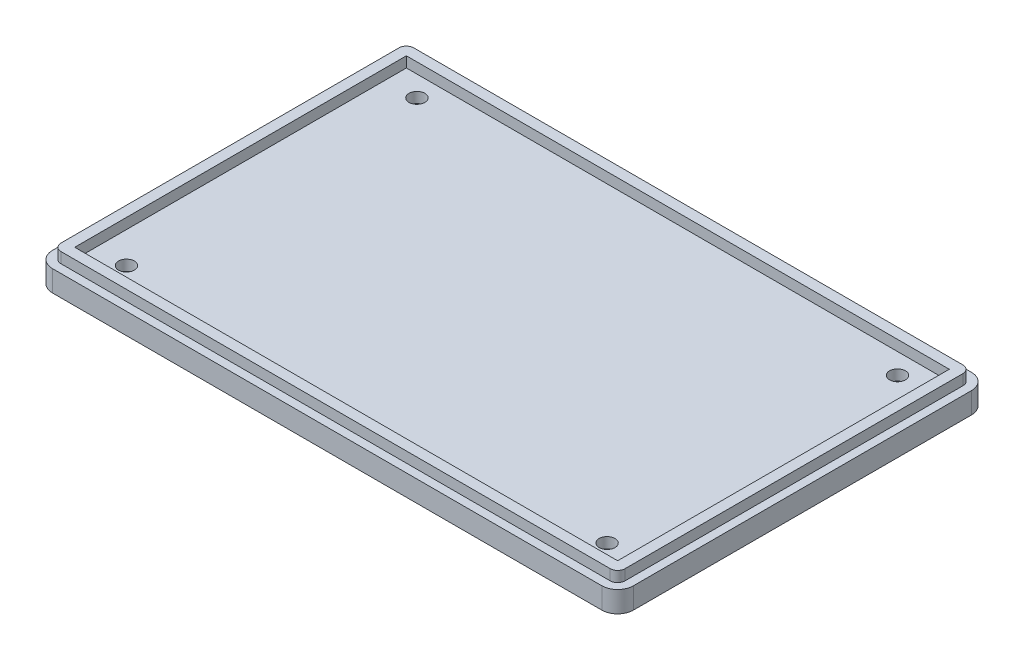
ISO-10303-21;
HEADER;
FILE_DESCRIPTION(('STEP AP214'),'2;1');
FILE_NAME('part.step','',(''),(''),'','','');
FILE_SCHEMA(('AUTOMOTIVE_DESIGN { 1 0 10303 214 1 1 1 1 }'));
ENDSEC;
DATA;
#1=APPLICATION_CONTEXT('core data for automotive mechanical design processes');
#2=APPLICATION_PROTOCOL_DEFINITION('international standard','automotive_design',2000,#1);
#3=PRODUCT_CONTEXT('',#1,'mechanical');
#4=PRODUCT('Part','Part','',(#3));
#5=PRODUCT_RELATED_PRODUCT_CATEGORY('part','',(#4));
#6=PRODUCT_DEFINITION_FORMATION('','',#4);
#7=PRODUCT_DEFINITION_CONTEXT('part definition',#1,'design');
#8=PRODUCT_DEFINITION('design','',#6,#7);
#9=PRODUCT_DEFINITION_SHAPE('','',#8);
#10=(LENGTH_UNIT() NAMED_UNIT(*) SI_UNIT(.MILLI.,.METRE.));
#11=(NAMED_UNIT(*) PLANE_ANGLE_UNIT() SI_UNIT($,.RADIAN.));
#12=(NAMED_UNIT(*) SI_UNIT($,.STERADIAN.) SOLID_ANGLE_UNIT());
#13=UNCERTAINTY_MEASURE_WITH_UNIT(LENGTH_MEASURE(1.E-05),#10,'distance_accuracy_value','');
#14=(GEOMETRIC_REPRESENTATION_CONTEXT(3) GLOBAL_UNCERTAINTY_ASSIGNED_CONTEXT((#13)) GLOBAL_UNIT_ASSIGNED_CONTEXT((#10,
#11,#12)) REPRESENTATION_CONTEXT('',''));
#15=CARTESIAN_POINT('',(0.,0.,0.));
#16=DIRECTION('',(0.,0.,1.));
#17=DIRECTION('',(1.,0.,0.));
#18=AXIS2_PLACEMENT_3D('',#15,#16,#17);
#19=CARTESIAN_POINT('',(-45.5,6.,27.5));
#20=DIRECTION('',(0.,-1.,0.));
#21=DIRECTION('',(0.,0.,-1.));
#22=AXIS2_PLACEMENT_3D('',#19,#20,#21);
#23=CYLINDRICAL_SURFACE('',#22,1.5);
#24=CARTESIAN_POINT('',(-45.5,4.,27.5));
#25=DIRECTION('',(0.,-1.,0.));
#26=DIRECTION('',(0.,0.,-1.));
#27=AXIS2_PLACEMENT_3D('',#24,#25,#26);
#28=CIRCLE('',#27,1.5);
#29=CARTESIAN_POINT('',(-45.5,4.,26.));
#30=VERTEX_POINT('',#29);
#31=EDGE_CURVE('E369',#30,#30,#28,.T.);
#32=ORIENTED_EDGE('',*,*,#31,.F.);
#33=EDGE_LOOP('',(#32));
#34=FACE_BOUND('',#33,.T.);
#35=CARTESIAN_POINT('',(-45.5,2.,27.5));
#36=DIRECTION('',(0.,-1.,0.));
#37=DIRECTION('',(0.,0.,-1.));
#38=AXIS2_PLACEMENT_3D('',#35,#36,#37);
#39=CIRCLE('',#38,1.5);
#40=CARTESIAN_POINT('',(-45.5,2.,26.));
#41=VERTEX_POINT('',#40);
#42=EDGE_CURVE('E74',#41,#41,#39,.F.);
#43=ORIENTED_EDGE('',*,*,#42,.F.);
#44=EDGE_LOOP('',(#43));
#45=FACE_BOUND('',#44,.T.);
#46=ADVANCED_FACE('F70',(#34,#45),#23,.F.);
#47=CARTESIAN_POINT('',(45.5,6.,27.5));
#48=DIRECTION('',(0.,-1.,0.));
#49=DIRECTION('',(0.,0.,-1.));
#50=AXIS2_PLACEMENT_3D('',#47,#48,#49);
#51=CYLINDRICAL_SURFACE('',#50,1.5);
#52=CARTESIAN_POINT('',(45.5,4.,27.5));
#53=DIRECTION('',(0.,-1.,0.));
#54=DIRECTION('',(0.,0.,-1.));
#55=AXIS2_PLACEMENT_3D('',#52,#53,#54);
#56=CIRCLE('',#55,1.5);
#57=CARTESIAN_POINT('',(45.5,4.,26.));
#58=VERTEX_POINT('',#57);
#59=EDGE_CURVE('E372',#58,#58,#56,.T.);
#60=ORIENTED_EDGE('',*,*,#59,.F.);
#61=EDGE_LOOP('',(#60));
#62=FACE_BOUND('',#61,.T.);
#63=CARTESIAN_POINT('',(45.5,2.,27.5));
#64=DIRECTION('',(0.,-1.,0.));
#65=DIRECTION('',(0.,0.,-1.));
#66=AXIS2_PLACEMENT_3D('',#63,#64,#65);
#67=CIRCLE('',#66,1.5);
#68=CARTESIAN_POINT('',(45.5,2.,26.));
#69=VERTEX_POINT('',#68);
#70=EDGE_CURVE('E386',#69,#69,#67,.F.);
#71=ORIENTED_EDGE('',*,*,#70,.F.);
#72=EDGE_LOOP('',(#71));
#73=FACE_BOUND('',#72,.T.);
#74=ADVANCED_FACE('F396',(#62,#73),#51,.F.);
#75=CARTESIAN_POINT('',(45.5,6.,-27.5));
#76=DIRECTION('',(0.,-1.,0.));
#77=DIRECTION('',(0.,0.,-1.));
#78=AXIS2_PLACEMENT_3D('',#75,#76,#77);
#79=CYLINDRICAL_SURFACE('',#78,1.5);
#80=CARTESIAN_POINT('',(45.5,4.,-27.5));
#81=DIRECTION('',(0.,-1.,0.));
#82=DIRECTION('',(0.,0.,-1.));
#83=AXIS2_PLACEMENT_3D('',#80,#81,#82);
#84=CIRCLE('',#83,1.5);
#85=CARTESIAN_POINT('',(45.5,4.,-29.));
#86=VERTEX_POINT('',#85);
#87=EDGE_CURVE('E375',#86,#86,#84,.T.);
#88=ORIENTED_EDGE('',*,*,#87,.F.);
#89=EDGE_LOOP('',(#88));
#90=FACE_BOUND('',#89,.T.);
#91=CARTESIAN_POINT('',(45.5,2.,-27.5));
#92=DIRECTION('',(0.,-1.,0.));
#93=DIRECTION('',(0.,0.,-1.));
#94=AXIS2_PLACEMENT_3D('',#91,#92,#93);
#95=CIRCLE('',#94,1.5);
#96=CARTESIAN_POINT('',(45.5,2.,-29.));
#97=VERTEX_POINT('',#96);
#98=EDGE_CURVE('E383',#97,#97,#95,.F.);
#99=ORIENTED_EDGE('',*,*,#98,.F.);
#100=EDGE_LOOP('',(#99));
#101=FACE_BOUND('',#100,.T.);
#102=ADVANCED_FACE('F402',(#90,#101),#79,.F.);
#103=CARTESIAN_POINT('',(-45.5,6.,-27.5));
#104=DIRECTION('',(0.,-1.,0.));
#105=DIRECTION('',(0.,0.,-1.));
#106=AXIS2_PLACEMENT_3D('',#103,#104,#105);
#107=CYLINDRICAL_SURFACE('',#106,1.5);
#108=CARTESIAN_POINT('',(-45.5,4.,-27.5));
#109=DIRECTION('',(0.,-1.,0.));
#110=DIRECTION('',(0.,0.,-1.));
#111=AXIS2_PLACEMENT_3D('',#108,#109,#110);
#112=CIRCLE('',#111,1.5);
#113=CARTESIAN_POINT('',(-45.5,4.,-29.));
#114=VERTEX_POINT('',#113);
#115=EDGE_CURVE('E242',#114,#114,#112,.T.);
#116=ORIENTED_EDGE('',*,*,#115,.F.);
#117=EDGE_LOOP('',(#116));
#118=FACE_BOUND('',#117,.T.);
#119=CARTESIAN_POINT('',(-45.5,2.,-27.5));
#120=DIRECTION('',(0.,-1.,0.));
#121=DIRECTION('',(0.,0.,-1.));
#122=AXIS2_PLACEMENT_3D('',#119,#120,#121);
#123=CIRCLE('',#122,1.5);
#124=CARTESIAN_POINT('',(-45.5,2.,-29.));
#125=VERTEX_POINT('',#124);
#126=EDGE_CURVE('E380',#125,#125,#123,.F.);
#127=ORIENTED_EDGE('',*,*,#126,.F.);
#128=EDGE_LOOP('',(#127));
#129=FACE_BOUND('',#128,.T.);
#130=ADVANCED_FACE('F408',(#118,#129),#107,.F.);
#131=CARTESIAN_POINT('',(-52.,4.,32.));
#132=DIRECTION('',(0.,-1.,0.));
#133=DIRECTION('',(0.,0.,-1.));
#134=AXIS2_PLACEMENT_3D('',#131,#132,#133);
#135=CYLINDRICAL_SURFACE('',#134,3.);
#136=CARTESIAN_POINT('',(-52.,0.,32.));
#137=DIRECTION('',(0.,-1.,0.));
#138=DIRECTION('',(0.,0.,-1.));
#139=AXIS2_PLACEMENT_3D('',#136,#137,#138);
#140=CIRCLE('',#139,3.);
#141=CARTESIAN_POINT('',(-52.,0.,35.));
#142=VERTEX_POINT('',#141);
#143=CARTESIAN_POINT('',(-55.,0.,32.));
#144=VERTEX_POINT('',#143);
#145=EDGE_CURVE('E298',#142,#144,#140,.T.);
#146=ORIENTED_EDGE('',*,*,#145,.F.);
#147=DIRECTION('',(0.,-1.,0.));
#148=VECTOR('',#147,1.);
#149=CARTESIAN_POINT('',(-52.,4.,35.));
#150=LINE('',#149,#148);
#151=CARTESIAN_POINT('',(-52.,4.,35.));
#152=VERTEX_POINT('',#151);
#153=EDGE_CURVE('E12',#152,#142,#150,.T.);
#154=ORIENTED_EDGE('',*,*,#153,.F.);
#155=CARTESIAN_POINT('',(-52.,4.,32.));
#156=DIRECTION('',(0.,-1.,0.));
#157=DIRECTION('',(0.,0.,-1.));
#158=AXIS2_PLACEMENT_3D('',#155,#156,#157);
#159=CIRCLE('',#158,3.);
#160=CARTESIAN_POINT('',(-55.,4.,32.));
#161=VERTEX_POINT('',#160);
#162=EDGE_CURVE('E312',#152,#161,#159,.T.);
#163=ORIENTED_EDGE('',*,*,#162,.T.);
#164=DIRECTION('',(0.,-1.,0.));
#165=VECTOR('',#164,1.);
#166=CARTESIAN_POINT('',(-55.,4.,32.));
#167=LINE('',#166,#165);
#168=EDGE_CURVE('E334',#161,#144,#167,.T.);
#169=ORIENTED_EDGE('',*,*,#168,.T.);
#170=EDGE_LOOP('',(#146,#154,#163,#169));
#171=FACE_BOUND('',#170,.T.);
#172=ADVANCED_FACE('F72',(#171),#135,.T.);
#173=CARTESIAN_POINT('',(-52.,4.,35.));
#174=DIRECTION('',(0.,0.,-1.));
#175=DIRECTION('',(-1.,0.,0.));
#176=AXIS2_PLACEMENT_3D('',#173,#174,#175);
#177=PLANE('',#176);
#178=DIRECTION('',(1.,0.,0.));
#179=VECTOR('',#178,1.);
#180=CARTESIAN_POINT('',(-52.,0.,35.));
#181=LINE('',#180,#179);
#182=CARTESIAN_POINT('',(52.,0.,35.));
#183=VERTEX_POINT('',#182);
#184=EDGE_CURVE('E316',#142,#183,#181,.T.);
#185=ORIENTED_EDGE('',*,*,#184,.T.);
#186=DIRECTION('',(0.,-1.,0.));
#187=VECTOR('',#186,1.);
#188=CARTESIAN_POINT('',(52.,4.,35.));
#189=LINE('',#188,#187);
#190=CARTESIAN_POINT('',(52.,4.,35.));
#191=VERTEX_POINT('',#190);
#192=EDGE_CURVE('E79',#191,#183,#189,.T.);
#193=ORIENTED_EDGE('',*,*,#192,.F.);
#194=DIRECTION('',(1.,0.,0.));
#195=VECTOR('',#194,1.);
#196=CARTESIAN_POINT('',(-52.,4.,35.));
#197=LINE('',#196,#195);
#198=EDGE_CURVE('E332',#152,#191,#197,.T.);
#199=ORIENTED_EDGE('',*,*,#198,.F.);
#200=ORIENTED_EDGE('',*,*,#153,.T.);
#201=EDGE_LOOP('',(#185,#193,#199,#200));
#202=FACE_BOUND('',#201,.T.);
#203=ADVANCED_FACE('F465',(#202),#177,.F.);
#204=CARTESIAN_POINT('',(52.,4.,32.));
#205=DIRECTION('',(0.,-1.,0.));
#206=DIRECTION('',(0.,0.,-1.));
#207=AXIS2_PLACEMENT_3D('',#204,#205,#206);
#208=CYLINDRICAL_SURFACE('',#207,3.);
#209=CARTESIAN_POINT('',(52.,0.,32.));
#210=DIRECTION('',(0.,1.,0.));
#211=DIRECTION('',(0.,0.,1.));
#212=AXIS2_PLACEMENT_3D('',#209,#210,#211);
#213=CIRCLE('',#212,3.);
#214=CARTESIAN_POINT('',(55.,0.,32.));
#215=VERTEX_POINT('',#214);
#216=EDGE_CURVE('E352',#183,#215,#213,.T.);
#217=ORIENTED_EDGE('',*,*,#216,.T.);
#218=DIRECTION('',(0.,-1.,0.));
#219=VECTOR('',#218,1.);
#220=CARTESIAN_POINT('',(55.,4.,32.));
#221=LINE('',#220,#219);
#222=CARTESIAN_POINT('',(55.,4.,32.));
#223=VERTEX_POINT('',#222);
#224=EDGE_CURVE('E357',#223,#215,#221,.T.);
#225=ORIENTED_EDGE('',*,*,#224,.F.);
#226=CARTESIAN_POINT('',(52.,4.,32.));
#227=DIRECTION('',(0.,1.,0.));
#228=DIRECTION('',(0.,0.,1.));
#229=AXIS2_PLACEMENT_3D('',#226,#227,#228);
#230=CIRCLE('',#229,3.);
#231=EDGE_CURVE('E330',#191,#223,#230,.T.);
#232=ORIENTED_EDGE('',*,*,#231,.F.);
#233=ORIENTED_EDGE('',*,*,#192,.T.);
#234=EDGE_LOOP('',(#217,#225,#232,#233));
#235=FACE_BOUND('',#234,.T.);
#236=ADVANCED_FACE('F468',(#235),#208,.T.);
#237=CARTESIAN_POINT('',(55.,4.,32.));
#238=DIRECTION('',(-1.,0.,0.));
#239=DIRECTION('',(0.,0.,1.));
#240=AXIS2_PLACEMENT_3D('',#237,#238,#239);
#241=PLANE('',#240);
#242=DIRECTION('',(0.,0.,-1.));
#243=VECTOR('',#242,1.);
#244=CARTESIAN_POINT('',(55.,0.,32.));
#245=LINE('',#244,#243);
#246=CARTESIAN_POINT('',(55.,0.,-32.));
#247=VERTEX_POINT('',#246);
#248=EDGE_CURVE('E349',#215,#247,#245,.T.);
#249=ORIENTED_EDGE('',*,*,#248,.T.);
#250=DIRECTION('',(0.,-1.,0.));
#251=VECTOR('',#250,1.);
#252=CARTESIAN_POINT('',(55.,4.,-32.));
#253=LINE('',#252,#251);
#254=CARTESIAN_POINT('',(55.,4.,-32.));
#255=VERTEX_POINT('',#254);
#256=EDGE_CURVE('E360',#255,#247,#253,.T.);
#257=ORIENTED_EDGE('',*,*,#256,.F.);
#258=DIRECTION('',(0.,0.,-1.));
#259=VECTOR('',#258,1.);
#260=CARTESIAN_POINT('',(55.,4.,32.));
#261=LINE('',#260,#259);
#262=EDGE_CURVE('E328',#223,#255,#261,.T.);
#263=ORIENTED_EDGE('',*,*,#262,.F.);
#264=ORIENTED_EDGE('',*,*,#224,.T.);
#265=EDGE_LOOP('',(#249,#257,#263,#264));
#266=FACE_BOUND('',#265,.T.);
#267=ADVANCED_FACE('F472',(#266),#241,.F.);
#268=CARTESIAN_POINT('',(52.,4.,-32.));
#269=DIRECTION('',(0.,-1.,0.));
#270=DIRECTION('',(0.,0.,-1.));
#271=AXIS2_PLACEMENT_3D('',#268,#269,#270);
#272=CYLINDRICAL_SURFACE('',#271,3.);
#273=CARTESIAN_POINT('',(52.,0.,-32.));
#274=DIRECTION('',(0.,-1.,0.));
#275=DIRECTION('',(0.,0.,-1.));
#276=AXIS2_PLACEMENT_3D('',#273,#274,#275);
#277=CIRCLE('',#276,3.);
#278=CARTESIAN_POINT('',(52.,0.,-35.));
#279=VERTEX_POINT('',#278);
#280=EDGE_CURVE('E346',#279,#247,#277,.T.);
#281=ORIENTED_EDGE('',*,*,#280,.F.);
#282=DIRECTION('',(0.,-1.,0.));
#283=VECTOR('',#282,1.);
#284=CARTESIAN_POINT('',(52.,4.,-35.));
#285=LINE('',#284,#283);
#286=CARTESIAN_POINT('',(52.,4.,-35.));
#287=VERTEX_POINT('',#286);
#288=EDGE_CURVE('E362',#287,#279,#285,.T.);
#289=ORIENTED_EDGE('',*,*,#288,.F.);
#290=CARTESIAN_POINT('',(52.,4.,-32.));
#291=DIRECTION('',(0.,-1.,0.));
#292=DIRECTION('',(0.,0.,-1.));
#293=AXIS2_PLACEMENT_3D('',#290,#291,#292);
#294=CIRCLE('',#293,3.);
#295=EDGE_CURVE('E325',#287,#255,#294,.T.);
#296=ORIENTED_EDGE('',*,*,#295,.T.);
#297=ORIENTED_EDGE('',*,*,#256,.T.);
#298=EDGE_LOOP('',(#281,#289,#296,#297));
#299=FACE_BOUND('',#298,.T.);
#300=ADVANCED_FACE('F476',(#299),#272,.T.);
#301=CARTESIAN_POINT('',(-52.,4.,-35.));
#302=DIRECTION('',(0.,0.,-1.));
#303=DIRECTION('',(-1.,0.,0.));
#304=AXIS2_PLACEMENT_3D('',#301,#302,#303);
#305=PLANE('',#304);
#306=DIRECTION('',(1.,0.,0.));
#307=VECTOR('',#306,1.);
#308=CARTESIAN_POINT('',(-52.,0.,-35.));
#309=LINE('',#308,#307);
#310=CARTESIAN_POINT('',(-52.,0.,-35.));
#311=VERTEX_POINT('',#310);
#312=EDGE_CURVE('E343',#311,#279,#309,.T.);
#313=ORIENTED_EDGE('',*,*,#312,.F.);
#314=DIRECTION('',(0.,-1.,0.));
#315=VECTOR('',#314,1.);
#316=CARTESIAN_POINT('',(-52.,4.,-35.));
#317=LINE('',#316,#315);
#318=CARTESIAN_POINT('',(-52.,4.,-35.));
#319=VERTEX_POINT('',#318);
#320=EDGE_CURVE('E364',#319,#311,#317,.T.);
#321=ORIENTED_EDGE('',*,*,#320,.F.);
#322=DIRECTION('',(1.,0.,0.));
#323=VECTOR('',#322,1.);
#324=CARTESIAN_POINT('',(-52.,4.,-35.));
#325=LINE('',#324,#323);
#326=EDGE_CURVE('E322',#319,#287,#325,.T.);
#327=ORIENTED_EDGE('',*,*,#326,.T.);
#328=ORIENTED_EDGE('',*,*,#288,.T.);
#329=EDGE_LOOP('',(#313,#321,#327,#328));
#330=FACE_BOUND('',#329,.T.);
#331=ADVANCED_FACE('F480',(#330),#305,.T.);
#332=CARTESIAN_POINT('',(-52.,4.,-32.));
#333=DIRECTION('',(0.,-1.,0.));
#334=DIRECTION('',(0.,0.,-1.));
#335=AXIS2_PLACEMENT_3D('',#332,#333,#334);
#336=CYLINDRICAL_SURFACE('',#335,3.);
#337=CARTESIAN_POINT('',(-52.,0.,-32.));
#338=DIRECTION('',(0.,-1.,0.));
#339=DIRECTION('',(0.,0.,-1.));
#340=AXIS2_PLACEMENT_3D('',#337,#338,#339);
#341=CIRCLE('',#340,3.);
#342=CARTESIAN_POINT('',(-55.,0.,-32.));
#343=VERTEX_POINT('',#342);
#344=EDGE_CURVE('E340',#343,#311,#341,.T.);
#345=ORIENTED_EDGE('',*,*,#344,.F.);
#346=DIRECTION('',(0.,-1.,0.));
#347=VECTOR('',#346,1.);
#348=CARTESIAN_POINT('',(-55.,4.,-32.));
#349=LINE('',#348,#347);
#350=CARTESIAN_POINT('',(-55.,4.,-32.));
#351=VERTEX_POINT('',#350);
#352=EDGE_CURVE('E366',#351,#343,#349,.T.);
#353=ORIENTED_EDGE('',*,*,#352,.F.);
#354=CARTESIAN_POINT('',(-52.,4.,-32.));
#355=DIRECTION('',(0.,-1.,0.));
#356=DIRECTION('',(0.,0.,-1.));
#357=AXIS2_PLACEMENT_3D('',#354,#355,#356);
#358=CIRCLE('',#357,3.);
#359=EDGE_CURVE('E319',#351,#319,#358,.T.);
#360=ORIENTED_EDGE('',*,*,#359,.T.);
#361=ORIENTED_EDGE('',*,*,#320,.T.);
#362=EDGE_LOOP('',(#345,#353,#360,#361));
#363=FACE_BOUND('',#362,.T.);
#364=ADVANCED_FACE('F484',(#363),#336,.T.);
#365=CARTESIAN_POINT('',(-55.,4.,32.));
#366=DIRECTION('',(-1.,0.,0.));
#367=DIRECTION('',(0.,0.,1.));
#368=AXIS2_PLACEMENT_3D('',#365,#366,#367);
#369=PLANE('',#368);
#370=DIRECTION('',(0.,0.,-1.));
#371=VECTOR('',#370,1.);
#372=CARTESIAN_POINT('',(-55.,0.,32.));
#373=LINE('',#372,#371);
#374=EDGE_CURVE('E337',#144,#343,#373,.T.);
#375=ORIENTED_EDGE('',*,*,#374,.F.);
#376=ORIENTED_EDGE('',*,*,#168,.F.);
#377=DIRECTION('',(0.,0.,-1.));
#378=VECTOR('',#377,1.);
#379=CARTESIAN_POINT('',(-55.,4.,32.));
#380=LINE('',#379,#378);
#381=EDGE_CURVE('E315',#161,#351,#380,.T.);
#382=ORIENTED_EDGE('',*,*,#381,.T.);
#383=ORIENTED_EDGE('',*,*,#352,.T.);
#384=EDGE_LOOP('',(#375,#376,#382,#383));
#385=FACE_BOUND('',#384,.T.);
#386=ADVANCED_FACE('F460',(#385),#369,.T.);
#387=CARTESIAN_POINT('',(-52.,4.,32.));
#388=DIRECTION('',(0.,-1.,0.));
#389=DIRECTION('',(0.,0.,-1.));
#390=AXIS2_PLACEMENT_3D('',#387,#388,#389);
#391=PLANE('',#390);
#392=DIRECTION('',(0.,0.,-1.));
#393=VECTOR('',#392,1.);
#394=CARTESIAN_POINT('',(-53.4,4.,32.));
#395=LINE('',#394,#393);
#396=CARTESIAN_POINT('',(-53.4,4.,32.));
#397=VERTEX_POINT('',#396);
#398=CARTESIAN_POINT('',(-53.4,4.,-32.));
#399=VERTEX_POINT('',#398);
#400=EDGE_CURVE('E256',#397,#399,#395,.T.);
#401=ORIENTED_EDGE('',*,*,#400,.T.);
#402=CARTESIAN_POINT('',(-52.,4.,-32.));
#403=DIRECTION('',(0.,-1.,0.));
#404=DIRECTION('',(0.,0.,-1.));
#405=AXIS2_PLACEMENT_3D('',#402,#403,#404);
#406=CIRCLE('',#405,1.4);
#407=CARTESIAN_POINT('',(-52.,4.,-33.4));
#408=VERTEX_POINT('',#407);
#409=EDGE_CURVE('E248',#399,#408,#406,.T.);
#410=ORIENTED_EDGE('',*,*,#409,.T.);
#411=DIRECTION('',(1.,0.,0.));
#412=VECTOR('',#411,1.);
#413=CARTESIAN_POINT('',(-52.,4.,-33.4));
#414=LINE('',#413,#412);
#415=CARTESIAN_POINT('',(52.,4.,-33.4));
#416=VERTEX_POINT('',#415);
#417=EDGE_CURVE('E278',#408,#416,#414,.T.);
#418=ORIENTED_EDGE('',*,*,#417,.T.);
#419=CARTESIAN_POINT('',(52.,4.,-32.));
#420=DIRECTION('',(0.,-1.,0.));
#421=DIRECTION('',(0.,0.,-1.));
#422=AXIS2_PLACEMENT_3D('',#419,#420,#421);
#423=CIRCLE('',#422,1.4);
#424=CARTESIAN_POINT('',(53.4,4.,-32.));
#425=VERTEX_POINT('',#424);
#426=EDGE_CURVE('E87',#416,#425,#423,.T.);
#427=ORIENTED_EDGE('',*,*,#426,.T.);
#428=DIRECTION('',(0.,0.,-1.));
#429=VECTOR('',#428,1.);
#430=CARTESIAN_POINT('',(53.4,4.,32.));
#431=LINE('',#430,#429);
#432=CARTESIAN_POINT('',(53.4,4.,32.));
#433=VERTEX_POINT('',#432);
#434=EDGE_CURVE('E282',#433,#425,#431,.T.);
#435=ORIENTED_EDGE('',*,*,#434,.F.);
#436=CARTESIAN_POINT('',(52.,4.,32.));
#437=DIRECTION('',(0.,-1.,0.));
#438=DIRECTION('',(0.,0.,-1.));
#439=AXIS2_PLACEMENT_3D('',#436,#437,#438);
#440=CIRCLE('',#439,1.4);
#441=CARTESIAN_POINT('',(52.,4.,33.4));
#442=VERTEX_POINT('',#441);
#443=EDGE_CURVE('E285',#433,#442,#440,.T.);
#444=ORIENTED_EDGE('',*,*,#443,.T.);
#445=DIRECTION('',(1.,0.,0.));
#446=VECTOR('',#445,1.);
#447=CARTESIAN_POINT('',(-52.,4.,33.4));
#448=LINE('',#447,#446);
#449=CARTESIAN_POINT('',(-52.,4.,33.4));
#450=VERTEX_POINT('',#449);
#451=EDGE_CURVE('E288',#450,#442,#448,.T.);
#452=ORIENTED_EDGE('',*,*,#451,.F.);
#453=CARTESIAN_POINT('',(-52.,4.,32.));
#454=DIRECTION('',(0.,-1.,0.));
#455=DIRECTION('',(0.,0.,-1.));
#456=AXIS2_PLACEMENT_3D('',#453,#454,#455);
#457=CIRCLE('',#456,1.40000000000001);
#458=EDGE_CURVE('E291',#450,#397,#457,.T.);
#459=ORIENTED_EDGE('',*,*,#458,.T.);
#460=EDGE_LOOP('',(#401,#410,#418,#427,#435,#444,#452,#459));
#461=FACE_BOUND('',#460,.T.);
#462=ORIENTED_EDGE('',*,*,#162,.F.);
#463=ORIENTED_EDGE('',*,*,#198,.T.);
#464=ORIENTED_EDGE('',*,*,#231,.T.);
#465=ORIENTED_EDGE('',*,*,#262,.T.);
#466=ORIENTED_EDGE('',*,*,#295,.F.);
#467=ORIENTED_EDGE('',*,*,#326,.F.);
#468=ORIENTED_EDGE('',*,*,#359,.F.);
#469=ORIENTED_EDGE('',*,*,#381,.F.);
#470=EDGE_LOOP('',(#462,#463,#464,#465,#466,#467,#468,#469));
#471=FACE_BOUND('',#470,.T.);
#472=ADVANCED_FACE('F457',(#461,#471),#391,.F.);
#473=CARTESIAN_POINT('',(-52.,0.,32.));
#474=DIRECTION('',(0.,-1.,0.));
#475=DIRECTION('',(0.,0.,-1.));
#476=AXIS2_PLACEMENT_3D('',#473,#474,#475);
#477=PLANE('',#476);
#478=CARTESIAN_POINT('',(45.5,0.,27.5));
#479=DIRECTION('',(0.,-1.,0.));
#480=DIRECTION('',(0.,0.,-1.));
#481=AXIS2_PLACEMENT_3D('',#478,#479,#480);
#482=CIRCLE('',#481,3.);
#483=CARTESIAN_POINT('',(45.5,0.,24.5));
#484=VERTEX_POINT('',#483);
#485=EDGE_CURVE('E585',#484,#484,#482,.T.);
#486=ORIENTED_EDGE('',*,*,#485,.F.);
#487=EDGE_LOOP('',(#486));
#488=FACE_BOUND('',#487,.T.);
#489=CARTESIAN_POINT('',(45.5,0.,-27.5));
#490=DIRECTION('',(0.,-1.,0.));
#491=DIRECTION('',(0.,0.,-1.));
#492=AXIS2_PLACEMENT_3D('',#489,#490,#491);
#493=CIRCLE('',#492,3.);
#494=CARTESIAN_POINT('',(45.5,0.,-30.5));
#495=VERTEX_POINT('',#494);
#496=EDGE_CURVE('E577',#495,#495,#493,.T.);
#497=ORIENTED_EDGE('',*,*,#496,.F.);
#498=EDGE_LOOP('',(#497));
#499=FACE_BOUND('',#498,.T.);
#500=CARTESIAN_POINT('',(-45.5,0.,-27.5));
#501=DIRECTION('',(0.,-1.,0.));
#502=DIRECTION('',(0.,0.,-1.));
#503=AXIS2_PLACEMENT_3D('',#500,#501,#502);
#504=CIRCLE('',#503,3.);
#505=CARTESIAN_POINT('',(-45.5,0.,-30.5));
#506=VERTEX_POINT('',#505);
#507=EDGE_CURVE('E571',#506,#506,#504,.T.);
#508=ORIENTED_EDGE('',*,*,#507,.F.);
#509=EDGE_LOOP('',(#508));
#510=FACE_BOUND('',#509,.T.);
#511=CARTESIAN_POINT('',(-45.5,0.,27.5));
#512=DIRECTION('',(0.,-1.,0.));
#513=DIRECTION('',(0.,0.,-1.));
#514=AXIS2_PLACEMENT_3D('',#511,#512,#513);
#515=CIRCLE('',#514,3.);
#516=CARTESIAN_POINT('',(-45.5,0.,24.5));
#517=VERTEX_POINT('',#516);
#518=EDGE_CURVE('E235',#517,#517,#515,.T.);
#519=ORIENTED_EDGE('',*,*,#518,.F.);
#520=EDGE_LOOP('',(#519));
#521=FACE_BOUND('',#520,.T.);
#522=ORIENTED_EDGE('',*,*,#145,.T.);
#523=ORIENTED_EDGE('',*,*,#374,.T.);
#524=ORIENTED_EDGE('',*,*,#344,.T.);
#525=ORIENTED_EDGE('',*,*,#312,.T.);
#526=ORIENTED_EDGE('',*,*,#280,.T.);
#527=ORIENTED_EDGE('',*,*,#248,.F.);
#528=ORIENTED_EDGE('',*,*,#216,.F.);
#529=ORIENTED_EDGE('',*,*,#184,.F.);
#530=EDGE_LOOP('',(#522,#523,#524,#525,#526,#527,#528,#529));
#531=FACE_BOUND('',#530,.T.);
#532=ADVANCED_FACE('F455',(#488,#499,#510,#521,#531),#477,.T.);
#533=CARTESIAN_POINT('',(-52.,6.,-32.));
#534=DIRECTION('',(0.,-1.,0.));
#535=DIRECTION('',(0.,0.,-1.));
#536=AXIS2_PLACEMENT_3D('',#533,#534,#535);
#537=CYLINDRICAL_SURFACE('',#536,1.4);
#538=ORIENTED_EDGE('',*,*,#409,.F.);
#539=DIRECTION('',(0.,-1.,0.));
#540=VECTOR('',#539,1.);
#541=CARTESIAN_POINT('',(-53.4,6.,-32.));
#542=LINE('',#541,#540);
#543=CARTESIAN_POINT('',(-53.4,6.,-32.));
#544=VERTEX_POINT('',#543);
#545=EDGE_CURVE('E296',#544,#399,#542,.T.);
#546=ORIENTED_EDGE('',*,*,#545,.F.);
#547=CARTESIAN_POINT('',(-52.,6.,-32.));
#548=DIRECTION('',(0.,-1.,0.));
#549=DIRECTION('',(0.,0.,-1.));
#550=AXIS2_PLACEMENT_3D('',#547,#548,#549);
#551=CIRCLE('',#550,1.4);
#552=CARTESIAN_POINT('',(-52.,6.,-33.4));
#553=VERTEX_POINT('',#552);
#554=EDGE_CURVE('E252',#544,#553,#551,.T.);
#555=ORIENTED_EDGE('',*,*,#554,.T.);
#556=DIRECTION('',(0.,-1.,0.));
#557=VECTOR('',#556,1.);
#558=CARTESIAN_POINT('',(-52.,6.,-33.4));
#559=LINE('',#558,#557);
#560=EDGE_CURVE('E275',#553,#408,#559,.T.);
#561=ORIENTED_EDGE('',*,*,#560,.T.);
#562=EDGE_LOOP('',(#538,#546,#555,#561));
#563=FACE_BOUND('',#562,.T.);
#564=ADVANCED_FACE('F430',(#563),#537,.T.);
#565=CARTESIAN_POINT('',(-53.4,6.,32.));
#566=DIRECTION('',(-1.,0.,0.));
#567=DIRECTION('',(0.,0.,1.));
#568=AXIS2_PLACEMENT_3D('',#565,#566,#567);
#569=PLANE('',#568);
#570=ORIENTED_EDGE('',*,*,#400,.F.);
#571=DIRECTION('',(0.,-1.,0.));
#572=VECTOR('',#571,1.);
#573=CARTESIAN_POINT('',(-53.4,6.,32.));
#574=LINE('',#573,#572);
#575=CARTESIAN_POINT('',(-53.4,6.,32.));
#576=VERTEX_POINT('',#575);
#577=EDGE_CURVE('E299',#576,#397,#574,.T.);
#578=ORIENTED_EDGE('',*,*,#577,.F.);
#579=DIRECTION('',(0.,0.,-1.));
#580=VECTOR('',#579,1.);
#581=CARTESIAN_POINT('',(-53.4,6.,32.));
#582=LINE('',#581,#580);
#583=EDGE_CURVE('E272',#576,#544,#582,.T.);
#584=ORIENTED_EDGE('',*,*,#583,.T.);
#585=ORIENTED_EDGE('',*,*,#545,.T.);
#586=EDGE_LOOP('',(#570,#578,#584,#585));
#587=FACE_BOUND('',#586,.T.);
#588=ADVANCED_FACE('F426',(#587),#569,.T.);
#589=CARTESIAN_POINT('',(-52.,6.,32.));
#590=DIRECTION('',(0.,-1.,0.));
#591=DIRECTION('',(0.,0.,-1.));
#592=AXIS2_PLACEMENT_3D('',#589,#590,#591);
#593=CYLINDRICAL_SURFACE('',#592,1.40000000000001);
#594=ORIENTED_EDGE('',*,*,#458,.F.);
#595=DIRECTION('',(0.,-1.,0.));
#596=VECTOR('',#595,1.);
#597=CARTESIAN_POINT('',(-52.,6.,33.4));
#598=LINE('',#597,#596);
#599=CARTESIAN_POINT('',(-52.,6.,33.4));
#600=VERTEX_POINT('',#599);
#601=EDGE_CURVE('E301',#600,#450,#598,.T.);
#602=ORIENTED_EDGE('',*,*,#601,.F.);
#603=CARTESIAN_POINT('',(-52.,6.,32.));
#604=DIRECTION('',(0.,-1.,0.));
#605=DIRECTION('',(0.,0.,-1.));
#606=AXIS2_PLACEMENT_3D('',#603,#604,#605);
#607=CIRCLE('',#606,1.40000000000001);
#608=EDGE_CURVE('E269',#600,#576,#607,.T.);
#609=ORIENTED_EDGE('',*,*,#608,.T.);
#610=ORIENTED_EDGE('',*,*,#577,.T.);
#611=EDGE_LOOP('',(#594,#602,#609,#610));
#612=FACE_BOUND('',#611,.T.);
#613=ADVANCED_FACE('F429',(#612),#593,.T.);
#614=CARTESIAN_POINT('',(-52.,6.,33.4));
#615=DIRECTION('',(0.,0.,-1.));
#616=DIRECTION('',(-1.,0.,0.));
#617=AXIS2_PLACEMENT_3D('',#614,#615,#616);
#618=PLANE('',#617);
#619=ORIENTED_EDGE('',*,*,#451,.T.);
#620=DIRECTION('',(0.,-1.,0.));
#621=VECTOR('',#620,1.);
#622=CARTESIAN_POINT('',(52.,6.,33.4));
#623=LINE('',#622,#621);
#624=CARTESIAN_POINT('',(52.,6.,33.4));
#625=VERTEX_POINT('',#624);
#626=EDGE_CURVE('E303',#625,#442,#623,.T.);
#627=ORIENTED_EDGE('',*,*,#626,.F.);
#628=DIRECTION('',(1.,0.,0.));
#629=VECTOR('',#628,1.);
#630=CARTESIAN_POINT('',(-52.,6.,33.4));
#631=LINE('',#630,#629);
#632=EDGE_CURVE('E267',#600,#625,#631,.T.);
#633=ORIENTED_EDGE('',*,*,#632,.F.);
#634=ORIENTED_EDGE('',*,*,#601,.T.);
#635=EDGE_LOOP('',(#619,#627,#633,#634));
#636=FACE_BOUND('',#635,.T.);
#637=ADVANCED_FACE('F434',(#636),#618,.F.);
#638=CARTESIAN_POINT('',(52.,6.,32.));
#639=DIRECTION('',(0.,-1.,0.));
#640=DIRECTION('',(0.,0.,-1.));
#641=AXIS2_PLACEMENT_3D('',#638,#639,#640);
#642=CYLINDRICAL_SURFACE('',#641,1.4);
#643=ORIENTED_EDGE('',*,*,#443,.F.);
#644=DIRECTION('',(0.,-1.,0.));
#645=VECTOR('',#644,1.);
#646=CARTESIAN_POINT('',(53.4,6.,32.));
#647=LINE('',#646,#645);
#648=CARTESIAN_POINT('',(53.4,6.,32.));
#649=VERTEX_POINT('',#648);
#650=EDGE_CURVE('E305',#649,#433,#647,.T.);
#651=ORIENTED_EDGE('',*,*,#650,.F.);
#652=CARTESIAN_POINT('',(52.,6.,32.));
#653=DIRECTION('',(0.,-1.,0.));
#654=DIRECTION('',(0.,0.,-1.));
#655=AXIS2_PLACEMENT_3D('',#652,#653,#654);
#656=CIRCLE('',#655,1.4);
#657=EDGE_CURVE('E264',#649,#625,#656,.T.);
#658=ORIENTED_EDGE('',*,*,#657,.T.);
#659=ORIENTED_EDGE('',*,*,#626,.T.);
#660=EDGE_LOOP('',(#643,#651,#658,#659));
#661=FACE_BOUND('',#660,.T.);
#662=ADVANCED_FACE('F438',(#661),#642,.T.);
#663=CARTESIAN_POINT('',(53.4,6.,32.));
#664=DIRECTION('',(-1.,0.,0.));
#665=DIRECTION('',(0.,0.,1.));
#666=AXIS2_PLACEMENT_3D('',#663,#664,#665);
#667=PLANE('',#666);
#668=ORIENTED_EDGE('',*,*,#434,.T.);
#669=DIRECTION('',(0.,-1.,0.));
#670=VECTOR('',#669,1.);
#671=CARTESIAN_POINT('',(53.4,6.,-32.));
#672=LINE('',#671,#670);
#673=CARTESIAN_POINT('',(53.4,6.,-32.));
#674=VERTEX_POINT('',#673);
#675=EDGE_CURVE('E307',#674,#425,#672,.T.);
#676=ORIENTED_EDGE('',*,*,#675,.F.);
#677=DIRECTION('',(0.,0.,-1.));
#678=VECTOR('',#677,1.);
#679=CARTESIAN_POINT('',(53.4,6.,32.));
#680=LINE('',#679,#678);
#681=EDGE_CURVE('E262',#649,#674,#680,.T.);
#682=ORIENTED_EDGE('',*,*,#681,.F.);
#683=ORIENTED_EDGE('',*,*,#650,.T.);
#684=EDGE_LOOP('',(#668,#676,#682,#683));
#685=FACE_BOUND('',#684,.T.);
#686=ADVANCED_FACE('F442',(#685),#667,.F.);
#687=CARTESIAN_POINT('',(52.,6.,-32.));
#688=DIRECTION('',(0.,-1.,0.));
#689=DIRECTION('',(0.,0.,-1.));
#690=AXIS2_PLACEMENT_3D('',#687,#688,#689);
#691=CYLINDRICAL_SURFACE('',#690,1.4);
#692=ORIENTED_EDGE('',*,*,#426,.F.);
#693=DIRECTION('',(0.,-1.,0.));
#694=VECTOR('',#693,1.);
#695=CARTESIAN_POINT('',(52.,6.,-33.4));
#696=LINE('',#695,#694);
#697=CARTESIAN_POINT('',(52.,6.,-33.4));
#698=VERTEX_POINT('',#697);
#699=EDGE_CURVE('E309',#698,#416,#696,.T.);
#700=ORIENTED_EDGE('',*,*,#699,.F.);
#701=CARTESIAN_POINT('',(52.,6.,-32.));
#702=DIRECTION('',(0.,-1.,0.));
#703=DIRECTION('',(0.,0.,-1.));
#704=AXIS2_PLACEMENT_3D('',#701,#702,#703);
#705=CIRCLE('',#704,1.4);
#706=EDGE_CURVE('E259',#698,#674,#705,.T.);
#707=ORIENTED_EDGE('',*,*,#706,.T.);
#708=ORIENTED_EDGE('',*,*,#675,.T.);
#709=EDGE_LOOP('',(#692,#700,#707,#708));
#710=FACE_BOUND('',#709,.T.);
#711=ADVANCED_FACE('F446',(#710),#691,.T.);
#712=CARTESIAN_POINT('',(-52.,6.,-33.4));
#713=DIRECTION('',(0.,0.,-1.));
#714=DIRECTION('',(-1.,0.,0.));
#715=AXIS2_PLACEMENT_3D('',#712,#713,#714);
#716=PLANE('',#715);
#717=ORIENTED_EDGE('',*,*,#417,.F.);
#718=ORIENTED_EDGE('',*,*,#560,.F.);
#719=DIRECTION('',(1.,0.,0.));
#720=VECTOR('',#719,1.);
#721=CARTESIAN_POINT('',(-52.,6.,-33.4));
#722=LINE('',#721,#720);
#723=EDGE_CURVE('E255',#553,#698,#722,.T.);
#724=ORIENTED_EDGE('',*,*,#723,.T.);
#725=ORIENTED_EDGE('',*,*,#699,.T.);
#726=EDGE_LOOP('',(#717,#718,#724,#725));
#727=FACE_BOUND('',#726,.T.);
#728=ADVANCED_FACE('F425',(#727),#716,.T.);
#729=CARTESIAN_POINT('',(-52.,6.,-32.));
#730=DIRECTION('',(0.,-1.,0.));
#731=DIRECTION('',(0.,0.,-1.));
#732=AXIS2_PLACEMENT_3D('',#729,#730,#731);
#733=PLANE('',#732);
#734=DIRECTION('',(0.,0.,-1.));
#735=VECTOR('',#734,1.);
#736=CARTESIAN_POINT('',(-51.4,6.,32.));
#737=LINE('',#736,#735);
#738=CARTESIAN_POINT('',(-51.4,6.,31.4));
#739=VERTEX_POINT('',#738);
#740=CARTESIAN_POINT('',(-51.4,6.,-31.4));
#741=VERTEX_POINT('',#740);
#742=EDGE_CURVE('E224',#739,#741,#737,.T.);
#743=ORIENTED_EDGE('',*,*,#742,.T.);
#744=DIRECTION('',(1.,0.,0.));
#745=VECTOR('',#744,1.);
#746=CARTESIAN_POINT('',(-52.,6.,-31.4));
#747=LINE('',#746,#745);
#748=CARTESIAN_POINT('',(51.4,6.,-31.4));
#749=VERTEX_POINT('',#748);
#750=EDGE_CURVE('E215',#741,#749,#747,.T.);
#751=ORIENTED_EDGE('',*,*,#750,.T.);
#752=DIRECTION('',(0.,0.,-1.));
#753=VECTOR('',#752,1.);
#754=CARTESIAN_POINT('',(51.4,6.,32.));
#755=LINE('',#754,#753);
#756=CARTESIAN_POINT('',(51.4,6.,31.4));
#757=VERTEX_POINT('',#756);
#758=EDGE_CURVE('E207',#757,#749,#755,.T.);
#759=ORIENTED_EDGE('',*,*,#758,.F.);
#760=DIRECTION('',(1.,0.,0.));
#761=VECTOR('',#760,1.);
#762=CARTESIAN_POINT('',(-52.,6.,31.4));
#763=LINE('',#762,#761);
#764=EDGE_CURVE('E214',#739,#757,#763,.T.);
#765=ORIENTED_EDGE('',*,*,#764,.F.);
#766=EDGE_LOOP('',(#743,#751,#759,#765));
#767=FACE_BOUND('',#766,.T.);
#768=ORIENTED_EDGE('',*,*,#554,.F.);
#769=ORIENTED_EDGE('',*,*,#583,.F.);
#770=ORIENTED_EDGE('',*,*,#608,.F.);
#771=ORIENTED_EDGE('',*,*,#632,.T.);
#772=ORIENTED_EDGE('',*,*,#657,.F.);
#773=ORIENTED_EDGE('',*,*,#681,.T.);
#774=ORIENTED_EDGE('',*,*,#706,.F.);
#775=ORIENTED_EDGE('',*,*,#723,.F.);
#776=EDGE_LOOP('',(#768,#769,#770,#771,#772,#773,#774,#775));
#777=FACE_BOUND('',#776,.T.);
#778=ADVANCED_FACE('F226',(#767,#777),#733,.F.);
#779=CARTESIAN_POINT('',(-52.,6.,-31.4));
#780=DIRECTION('',(0.,0.,-1.));
#781=DIRECTION('',(-1.,0.,0.));
#782=AXIS2_PLACEMENT_3D('',#779,#780,#781);
#783=PLANE('',#782);
#784=DIRECTION('',(1.,0.,0.));
#785=VECTOR('',#784,1.);
#786=CARTESIAN_POINT('',(-52.,4.,-31.4));
#787=LINE('',#786,#785);
#788=CARTESIAN_POINT('',(-51.4,4.,-31.4));
#789=VERTEX_POINT('',#788);
#790=CARTESIAN_POINT('',(51.4,4.,-31.4));
#791=VERTEX_POINT('',#790);
#792=EDGE_CURVE('E222',#789,#791,#787,.T.);
#793=ORIENTED_EDGE('',*,*,#792,.T.);
#794=DIRECTION('',(0.,-1.,0.));
#795=VECTOR('',#794,1.);
#796=CARTESIAN_POINT('',(51.4,6.,-31.4));
#797=LINE('',#796,#795);
#798=EDGE_CURVE('E95',#749,#791,#797,.T.);
#799=ORIENTED_EDGE('',*,*,#798,.F.);
#800=ORIENTED_EDGE('',*,*,#750,.F.);
#801=DIRECTION('',(0.,-1.,0.));
#802=VECTOR('',#801,1.);
#803=CARTESIAN_POINT('',(-51.4,6.,-31.4));
#804=LINE('',#803,#802);
#805=EDGE_CURVE('E246',#741,#789,#804,.T.);
#806=ORIENTED_EDGE('',*,*,#805,.T.);
#807=EDGE_LOOP('',(#793,#799,#800,#806));
#808=FACE_BOUND('',#807,.T.);
#809=ADVANCED_FACE('F219',(#808),#783,.F.);
#810=CARTESIAN_POINT('',(-51.4,6.,32.));
#811=DIRECTION('',(-1.,0.,0.));
#812=DIRECTION('',(0.,0.,1.));
#813=AXIS2_PLACEMENT_3D('',#810,#811,#812);
#814=PLANE('',#813);
#815=DIRECTION('',(0.,0.,-1.));
#816=VECTOR('',#815,1.);
#817=CARTESIAN_POINT('',(-51.4,4.,32.));
#818=LINE('',#817,#816);
#819=CARTESIAN_POINT('',(-51.4,4.,31.4));
#820=VERTEX_POINT('',#819);
#821=EDGE_CURVE('E229',#820,#789,#818,.T.);
#822=ORIENTED_EDGE('',*,*,#821,.T.);
#823=ORIENTED_EDGE('',*,*,#805,.F.);
#824=ORIENTED_EDGE('',*,*,#742,.F.);
#825=DIRECTION('',(0.,-1.,0.));
#826=VECTOR('',#825,1.);
#827=CARTESIAN_POINT('',(-51.4,6.,31.4));
#828=LINE('',#827,#826);
#829=EDGE_CURVE('E249',#739,#820,#828,.T.);
#830=ORIENTED_EDGE('',*,*,#829,.T.);
#831=EDGE_LOOP('',(#822,#823,#824,#830));
#832=FACE_BOUND('',#831,.T.);
#833=ADVANCED_FACE('F410',(#832),#814,.F.);
#834=CARTESIAN_POINT('',(-52.,6.,31.4));
#835=DIRECTION('',(0.,0.,-1.));
#836=DIRECTION('',(-1.,0.,0.));
#837=AXIS2_PLACEMENT_3D('',#834,#835,#836);
#838=PLANE('',#837);
#839=DIRECTION('',(1.,0.,0.));
#840=VECTOR('',#839,1.);
#841=CARTESIAN_POINT('',(-52.,4.,31.4));
#842=LINE('',#841,#840);
#843=CARTESIAN_POINT('',(51.4,4.,31.4));
#844=VERTEX_POINT('',#843);
#845=EDGE_CURVE('E232',#820,#844,#842,.T.);
#846=ORIENTED_EDGE('',*,*,#845,.F.);
#847=ORIENTED_EDGE('',*,*,#829,.F.);
#848=ORIENTED_EDGE('',*,*,#764,.T.);
#849=DIRECTION('',(0.,-1.,0.));
#850=VECTOR('',#849,1.);
#851=CARTESIAN_POINT('',(51.4,6.,31.4));
#852=LINE('',#851,#850);
#853=EDGE_CURVE('E209',#757,#844,#852,.T.);
#854=ORIENTED_EDGE('',*,*,#853,.T.);
#855=EDGE_LOOP('',(#846,#847,#848,#854));
#856=FACE_BOUND('',#855,.T.);
#857=ADVANCED_FACE('F413',(#856),#838,.T.);
#858=CARTESIAN_POINT('',(51.4,6.,32.));
#859=DIRECTION('',(-1.,0.,0.));
#860=DIRECTION('',(0.,0.,1.));
#861=AXIS2_PLACEMENT_3D('',#858,#859,#860);
#862=PLANE('',#861);
#863=DIRECTION('',(0.,0.,-1.));
#864=VECTOR('',#863,1.);
#865=CARTESIAN_POINT('',(51.4,4.,32.));
#866=LINE('',#865,#864);
#867=EDGE_CURVE('E241',#844,#791,#866,.T.);
#868=ORIENTED_EDGE('',*,*,#867,.F.);
#869=ORIENTED_EDGE('',*,*,#853,.F.);
#870=ORIENTED_EDGE('',*,*,#758,.T.);
#871=ORIENTED_EDGE('',*,*,#798,.T.);
#872=EDGE_LOOP('',(#868,#869,#870,#871));
#873=FACE_BOUND('',#872,.T.);
#874=ADVANCED_FACE('F208',(#873),#862,.T.);
#875=ORIENTED_EDGE('',*,*,#115,.T.);
#876=EDGE_LOOP('',(#875));
#877=FACE_BOUND('',#876,.T.);
#878=ORIENTED_EDGE('',*,*,#87,.T.);
#879=EDGE_LOOP('',(#878));
#880=FACE_BOUND('',#879,.T.);
#881=ORIENTED_EDGE('',*,*,#59,.T.);
#882=EDGE_LOOP('',(#881));
#883=FACE_BOUND('',#882,.T.);
#884=ORIENTED_EDGE('',*,*,#31,.T.);
#885=EDGE_LOOP('',(#884));
#886=FACE_BOUND('',#885,.T.);
#887=ORIENTED_EDGE('',*,*,#792,.F.);
#888=ORIENTED_EDGE('',*,*,#821,.F.);
#889=ORIENTED_EDGE('',*,*,#845,.T.);
#890=ORIENTED_EDGE('',*,*,#867,.T.);
#891=EDGE_LOOP('',(#887,#888,#889,#890));
#892=FACE_BOUND('',#891,.T.);
#893=ADVANCED_FACE('F420',(#877,#880,#883,#886,#892),#391,.F.);
#894=CARTESIAN_POINT('',(-45.5,2.,-27.5));
#895=DIRECTION('',(0.,-1.,0.));
#896=DIRECTION('',(0.,0.,-1.));
#897=AXIS2_PLACEMENT_3D('',#894,#895,#896);
#898=PLANE('',#897);
#899=CARTESIAN_POINT('',(-45.5,2.,-27.5));
#900=DIRECTION('',(0.,-1.,0.));
#901=DIRECTION('',(0.,0.,-1.));
#902=AXIS2_PLACEMENT_3D('',#899,#900,#901);
#903=CIRCLE('',#902,3.);
#904=CARTESIAN_POINT('',(-45.5,2.,-30.5));
#905=VERTEX_POINT('',#904);
#906=EDGE_CURVE('E573',#905,#905,#903,.T.);
#907=ORIENTED_EDGE('',*,*,#906,.T.);
#908=EDGE_LOOP('',(#907));
#909=FACE_BOUND('',#908,.T.);
#910=ORIENTED_EDGE('',*,*,#126,.T.);
#911=EDGE_LOOP('',(#910));
#912=FACE_BOUND('',#911,.T.);
#913=ADVANCED_FACE('F527',(#909,#912),#898,.T.);
#914=CARTESIAN_POINT('',(-45.5,2.,-27.5));
#915=DIRECTION('',(0.,-1.,0.));
#916=DIRECTION('',(0.,0.,-1.));
#917=AXIS2_PLACEMENT_3D('',#914,#915,#916);
#918=CYLINDRICAL_SURFACE('',#917,3.);
#919=ORIENTED_EDGE('',*,*,#906,.F.);
#920=EDGE_LOOP('',(#919));
#921=FACE_BOUND('',#920,.T.);
#922=ORIENTED_EDGE('',*,*,#507,.T.);
#923=EDGE_LOOP('',(#922));
#924=FACE_BOUND('',#923,.T.);
#925=ADVANCED_FACE('F529',(#921,#924),#918,.F.);
#926=CARTESIAN_POINT('',(45.5,2.,-27.5));
#927=DIRECTION('',(0.,-1.,0.));
#928=DIRECTION('',(0.,0.,-1.));
#929=AXIS2_PLACEMENT_3D('',#926,#927,#928);
#930=PLANE('',#929);
#931=CARTESIAN_POINT('',(45.5,2.,-27.5));
#932=DIRECTION('',(0.,-1.,0.));
#933=DIRECTION('',(0.,0.,-1.));
#934=AXIS2_PLACEMENT_3D('',#931,#932,#933);
#935=CIRCLE('',#934,3.);
#936=CARTESIAN_POINT('',(45.5,2.,-30.5));
#937=VERTEX_POINT('',#936);
#938=EDGE_CURVE('E582',#937,#937,#935,.T.);
#939=ORIENTED_EDGE('',*,*,#938,.T.);
#940=EDGE_LOOP('',(#939));
#941=FACE_BOUND('',#940,.T.);
#942=ORIENTED_EDGE('',*,*,#98,.T.);
#943=EDGE_LOOP('',(#942));
#944=FACE_BOUND('',#943,.T.);
#945=ADVANCED_FACE('F536',(#941,#944),#930,.T.);
#946=CARTESIAN_POINT('',(45.5,2.,-27.5));
#947=DIRECTION('',(0.,-1.,0.));
#948=DIRECTION('',(0.,0.,-1.));
#949=AXIS2_PLACEMENT_3D('',#946,#947,#948);
#950=CYLINDRICAL_SURFACE('',#949,3.);
#951=ORIENTED_EDGE('',*,*,#938,.F.);
#952=EDGE_LOOP('',(#951));
#953=FACE_BOUND('',#952,.T.);
#954=ORIENTED_EDGE('',*,*,#496,.T.);
#955=EDGE_LOOP('',(#954));
#956=FACE_BOUND('',#955,.T.);
#957=ADVANCED_FACE('F542',(#953,#956),#950,.F.);
#958=CARTESIAN_POINT('',(45.5,2.,27.5));
#959=DIRECTION('',(0.,-1.,0.));
#960=DIRECTION('',(0.,0.,-1.));
#961=AXIS2_PLACEMENT_3D('',#958,#959,#960);
#962=PLANE('',#961);
#963=CARTESIAN_POINT('',(45.5,2.,27.5));
#964=DIRECTION('',(0.,-1.,0.));
#965=DIRECTION('',(0.,0.,-1.));
#966=AXIS2_PLACEMENT_3D('',#963,#964,#965);
#967=CIRCLE('',#966,3.);
#968=CARTESIAN_POINT('',(45.5,2.,24.5));
#969=VERTEX_POINT('',#968);
#970=EDGE_CURVE('E588',#969,#969,#967,.T.);
#971=ORIENTED_EDGE('',*,*,#970,.T.);
#972=EDGE_LOOP('',(#971));
#973=FACE_BOUND('',#972,.T.);
#974=ORIENTED_EDGE('',*,*,#70,.T.);
#975=EDGE_LOOP('',(#974));
#976=FACE_BOUND('',#975,.T.);
#977=ADVANCED_FACE('F545',(#973,#976),#962,.T.);
#978=CARTESIAN_POINT('',(45.5,2.,27.5));
#979=DIRECTION('',(0.,-1.,0.));
#980=DIRECTION('',(0.,0.,-1.));
#981=AXIS2_PLACEMENT_3D('',#978,#979,#980);
#982=CYLINDRICAL_SURFACE('',#981,3.);
#983=ORIENTED_EDGE('',*,*,#970,.F.);
#984=EDGE_LOOP('',(#983));
#985=FACE_BOUND('',#984,.T.);
#986=ORIENTED_EDGE('',*,*,#485,.T.);
#987=EDGE_LOOP('',(#986));
#988=FACE_BOUND('',#987,.T.);
#989=ADVANCED_FACE('F550',(#985,#988),#982,.F.);
#990=CARTESIAN_POINT('',(-45.5,2.,27.5));
#991=DIRECTION('',(0.,-1.,0.));
#992=DIRECTION('',(0.,0.,-1.));
#993=AXIS2_PLACEMENT_3D('',#990,#991,#992);
#994=PLANE('',#993);
#995=CARTESIAN_POINT('',(-45.5,2.,27.5));
#996=DIRECTION('',(0.,-1.,0.));
#997=DIRECTION('',(0.,0.,-1.));
#998=AXIS2_PLACEMENT_3D('',#995,#996,#997);
#999=CIRCLE('',#998,3.);
#1000=CARTESIAN_POINT('',(-45.5,2.,24.5));
#1001=VERTEX_POINT('',#1000);
#1002=EDGE_CURVE('E384',#1001,#1001,#999,.T.);
#1003=ORIENTED_EDGE('',*,*,#1002,.T.);
#1004=EDGE_LOOP('',(#1003));
#1005=FACE_BOUND('',#1004,.T.);
#1006=ORIENTED_EDGE('',*,*,#42,.T.);
#1007=EDGE_LOOP('',(#1006));
#1008=FACE_BOUND('',#1007,.T.);
#1009=ADVANCED_FACE('F393',(#1005,#1008),#994,.T.);
#1010=CARTESIAN_POINT('',(-45.5,2.,27.5));
#1011=DIRECTION('',(0.,-1.,0.));
#1012=DIRECTION('',(0.,0.,-1.));
#1013=AXIS2_PLACEMENT_3D('',#1010,#1011,#1012);
#1014=CYLINDRICAL_SURFACE('',#1013,3.);
#1015=ORIENTED_EDGE('',*,*,#1002,.F.);
#1016=EDGE_LOOP('',(#1015));
#1017=FACE_BOUND('',#1016,.T.);
#1018=ORIENTED_EDGE('',*,*,#518,.T.);
#1019=EDGE_LOOP('',(#1018));
#1020=FACE_BOUND('',#1019,.T.);
#1021=ADVANCED_FACE('F559',(#1017,#1020),#1014,.F.);
#1022=CLOSED_SHELL('',(#46,#74,#102,#130,#172,#203,#236,#267,#300,#331,#364,#386,#472,#532,#564,
#588,#613,#637,#662,#686,#711,#728,#778,#809,#833,#857,#874,#893,#913,#925,#945,#957,#977,#989,
#1009,#1021));
#1023=MANIFOLD_SOLID_BREP('B2',#1022);
#1024=ADVANCED_BREP_SHAPE_REPRESENTATION('',(#18,#1023),#14);
#1025=SHAPE_DEFINITION_REPRESENTATION(#9,#1024);
ENDSEC;
END-ISO-10303-21;
